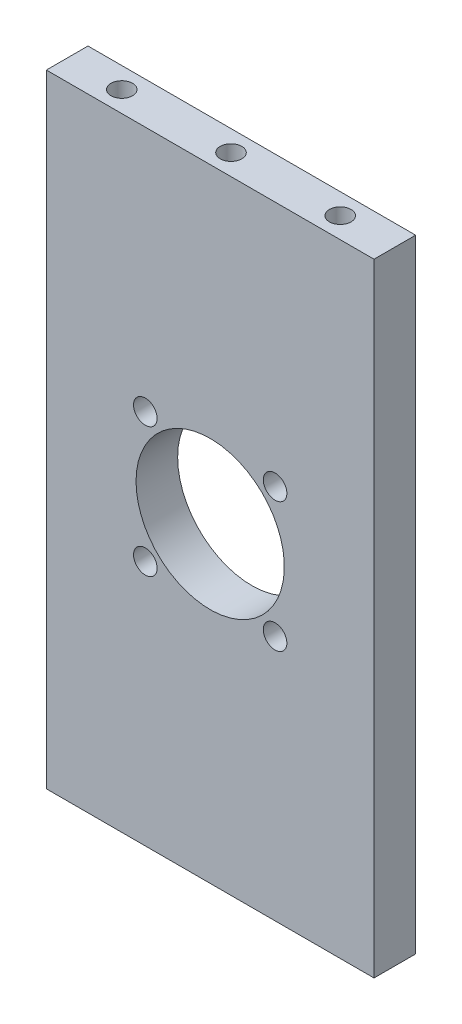
ISO-10303-21;
HEADER;
FILE_DESCRIPTION(('STEP AP214'),'2;1');
FILE_NAME('part.step','',(''),(''),'','','');
FILE_SCHEMA(('AUTOMOTIVE_DESIGN { 1 0 10303 214 1 1 1 1 }'));
ENDSEC;
DATA;
#1=APPLICATION_CONTEXT('core data for automotive mechanical design processes');
#2=APPLICATION_PROTOCOL_DEFINITION('international standard','automotive_design',2000,#1);
#3=PRODUCT_CONTEXT('',#1,'mechanical');
#4=PRODUCT('Part','Part','',(#3));
#5=PRODUCT_RELATED_PRODUCT_CATEGORY('part','',(#4));
#6=PRODUCT_DEFINITION_FORMATION('','',#4);
#7=PRODUCT_DEFINITION_CONTEXT('part definition',#1,'design');
#8=PRODUCT_DEFINITION('design','',#6,#7);
#9=PRODUCT_DEFINITION_SHAPE('','',#8);
#10=(LENGTH_UNIT() NAMED_UNIT(*) SI_UNIT(.MILLI.,.METRE.));
#11=(NAMED_UNIT(*) PLANE_ANGLE_UNIT() SI_UNIT($,.RADIAN.));
#12=(NAMED_UNIT(*) SI_UNIT($,.STERADIAN.) SOLID_ANGLE_UNIT());
#13=UNCERTAINTY_MEASURE_WITH_UNIT(LENGTH_MEASURE(1.E-05),#10,'distance_accuracy_value','');
#14=(GEOMETRIC_REPRESENTATION_CONTEXT(3) GLOBAL_UNCERTAINTY_ASSIGNED_CONTEXT((#13)) GLOBAL_UNIT_ASSIGNED_CONTEXT((#10,
#11,#12)) REPRESENTATION_CONTEXT('',''));
#15=CARTESIAN_POINT('',(0.,0.,0.));
#16=DIRECTION('',(0.,0.,1.));
#17=DIRECTION('',(1.,0.,0.));
#18=AXIS2_PLACEMENT_3D('',#15,#16,#17);
#19=CARTESIAN_POINT('',(25.,-47.5,-6.35));
#20=DIRECTION('',(1.,0.,0.));
#21=DIRECTION('',(0.,0.,-1.));
#22=AXIS2_PLACEMENT_3D('',#19,#20,#21);
#23=PLANE('',#22);
#24=DIRECTION('',(0.,1.,0.));
#25=VECTOR('',#24,1.);
#26=CARTESIAN_POINT('',(25.,-47.5,0.));
#27=LINE('',#26,#25);
#28=CARTESIAN_POINT('',(25.,-47.5,0.));
#29=VERTEX_POINT('',#28);
#30=CARTESIAN_POINT('',(25.,47.5,0.));
#31=VERTEX_POINT('',#30);
#32=EDGE_CURVE('E173',#29,#31,#27,.T.);
#33=ORIENTED_EDGE('',*,*,#32,.F.);
#34=DIRECTION('',(0.,0.,1.));
#35=VECTOR('',#34,1.);
#36=CARTESIAN_POINT('',(25.,-47.5,-6.35));
#37=LINE('',#36,#35);
#38=CARTESIAN_POINT('',(25.,-47.5,-6.35));
#39=VERTEX_POINT('',#38);
#40=EDGE_CURVE('E11',#39,#29,#37,.T.);
#41=ORIENTED_EDGE('',*,*,#40,.F.);
#42=DIRECTION('',(0.,1.,0.));
#43=VECTOR('',#42,1.);
#44=CARTESIAN_POINT('',(25.,-47.5,-6.35));
#45=LINE('',#44,#43);
#46=CARTESIAN_POINT('',(25.,47.5,-6.35));
#47=VERTEX_POINT('',#46);
#48=EDGE_CURVE('E174',#39,#47,#45,.T.);
#49=ORIENTED_EDGE('',*,*,#48,.T.);
#50=DIRECTION('',(0.,0.,1.));
#51=VECTOR('',#50,1.);
#52=CARTESIAN_POINT('',(25.,47.5,-6.35));
#53=LINE('',#52,#51);
#54=EDGE_CURVE('E50',#47,#31,#53,.T.);
#55=ORIENTED_EDGE('',*,*,#54,.T.);
#56=EDGE_LOOP('',(#33,#41,#49,#55));
#57=FACE_BOUND('',#56,.T.);
#58=ADVANCED_FACE('F47',(#57),#23,.T.);
#59=CARTESIAN_POINT('',(-25.,-47.5,-6.35));
#60=DIRECTION('',(0.,-1.,0.));
#61=DIRECTION('',(0.,0.,-1.));
#62=AXIS2_PLACEMENT_3D('',#59,#60,#61);
#63=PLANE('',#62);
#64=CARTESIAN_POINT('',(16.67,-47.5,-3.175));
#65=DIRECTION('',(0.,-1.,0.));
#66=DIRECTION('',(0.,0.,-1.));
#67=AXIS2_PLACEMENT_3D('',#64,#65,#66);
#68=CIRCLE('',#67,1.65);
#69=CARTESIAN_POINT('',(16.67,-47.5,-4.825));
#70=VERTEX_POINT('',#69);
#71=EDGE_CURVE('E149',#70,#70,#68,.T.);
#72=ORIENTED_EDGE('',*,*,#71,.F.);
#73=EDGE_LOOP('',(#72));
#74=FACE_BOUND('',#73,.T.);
#75=CARTESIAN_POINT('',(0.,-47.5,-3.175));
#76=DIRECTION('',(0.,-1.,0.));
#77=DIRECTION('',(0.,0.,-1.));
#78=AXIS2_PLACEMENT_3D('',#75,#76,#77);
#79=CIRCLE('',#78,1.65);
#80=CARTESIAN_POINT('',(0.,-47.5,-4.825));
#81=VERTEX_POINT('',#80);
#82=EDGE_CURVE('E157',#81,#81,#79,.T.);
#83=ORIENTED_EDGE('',*,*,#82,.F.);
#84=EDGE_LOOP('',(#83));
#85=FACE_BOUND('',#84,.T.);
#86=CARTESIAN_POINT('',(-16.67,-47.5,-3.175));
#87=DIRECTION('',(0.,-1.,0.));
#88=DIRECTION('',(0.,0.,-1.));
#89=AXIS2_PLACEMENT_3D('',#86,#87,#88);
#90=CIRCLE('',#89,1.65);
#91=CARTESIAN_POINT('',(-16.67,-47.5,-4.825));
#92=VERTEX_POINT('',#91);
#93=EDGE_CURVE('E165',#92,#92,#90,.T.);
#94=ORIENTED_EDGE('',*,*,#93,.F.);
#95=EDGE_LOOP('',(#94));
#96=FACE_BOUND('',#95,.T.);
#97=DIRECTION('',(1.,0.,0.));
#98=VECTOR('',#97,1.);
#99=CARTESIAN_POINT('',(-25.,-47.5,0.));
#100=LINE('',#99,#98);
#101=CARTESIAN_POINT('',(-25.,-47.5,0.));
#102=VERTEX_POINT('',#101);
#103=EDGE_CURVE('E178',#102,#29,#100,.T.);
#104=ORIENTED_EDGE('',*,*,#103,.F.);
#105=DIRECTION('',(0.,0.,1.));
#106=VECTOR('',#105,1.);
#107=CARTESIAN_POINT('',(-25.,-47.5,-6.35));
#108=LINE('',#107,#106);
#109=CARTESIAN_POINT('',(-25.,-47.5,-6.35));
#110=VERTEX_POINT('',#109);
#111=EDGE_CURVE('E57',#110,#102,#108,.T.);
#112=ORIENTED_EDGE('',*,*,#111,.F.);
#113=DIRECTION('',(1.,0.,0.));
#114=VECTOR('',#113,1.);
#115=CARTESIAN_POINT('',(-25.,-47.5,-6.35));
#116=LINE('',#115,#114);
#117=EDGE_CURVE('E184',#110,#39,#116,.T.);
#118=ORIENTED_EDGE('',*,*,#117,.T.);
#119=ORIENTED_EDGE('',*,*,#40,.T.);
#120=EDGE_LOOP('',(#104,#112,#118,#119));
#121=FACE_BOUND('',#120,.T.);
#122=ADVANCED_FACE('F211',(#74,#85,#96,#121),#63,.T.);
#123=CARTESIAN_POINT('',(-25.,-47.5,-6.35));
#124=DIRECTION('',(-1.,0.,0.));
#125=DIRECTION('',(0.,0.,1.));
#126=AXIS2_PLACEMENT_3D('',#123,#124,#125);
#127=PLANE('',#126);
#128=DIRECTION('',(0.,-1.,0.));
#129=VECTOR('',#128,1.);
#130=CARTESIAN_POINT('',(-25.,-47.5,0.));
#131=LINE('',#130,#129);
#132=CARTESIAN_POINT('',(-25.,47.5,0.));
#133=VERTEX_POINT('',#132);
#134=EDGE_CURVE('E194',#133,#102,#131,.T.);
#135=ORIENTED_EDGE('',*,*,#134,.F.);
#136=DIRECTION('',(0.,0.,1.));
#137=VECTOR('',#136,1.);
#138=CARTESIAN_POINT('',(-25.,47.5,-6.35));
#139=LINE('',#138,#137);
#140=CARTESIAN_POINT('',(-25.,47.5,-6.35));
#141=VERTEX_POINT('',#140);
#142=EDGE_CURVE('E201',#141,#133,#139,.T.);
#143=ORIENTED_EDGE('',*,*,#142,.F.);
#144=DIRECTION('',(0.,-1.,0.));
#145=VECTOR('',#144,1.);
#146=CARTESIAN_POINT('',(-25.,-47.5,-6.35));
#147=LINE('',#146,#145);
#148=EDGE_CURVE('E181',#141,#110,#147,.T.);
#149=ORIENTED_EDGE('',*,*,#148,.T.);
#150=ORIENTED_EDGE('',*,*,#111,.T.);
#151=EDGE_LOOP('',(#135,#143,#149,#150));
#152=FACE_BOUND('',#151,.T.);
#153=ADVANCED_FACE('F214',(#152),#127,.T.);
#154=CARTESIAN_POINT('',(-25.,47.5,-6.35));
#155=DIRECTION('',(0.,1.,0.));
#156=DIRECTION('',(0.,0.,1.));
#157=AXIS2_PLACEMENT_3D('',#154,#155,#156);
#158=PLANE('',#157);
#159=CARTESIAN_POINT('',(-16.67,47.5,-3.175));
#160=DIRECTION('',(0.,1.,0.));
#161=DIRECTION('',(0.,0.,1.));
#162=AXIS2_PLACEMENT_3D('',#159,#160,#161);
#163=CIRCLE('',#162,1.65);
#164=CARTESIAN_POINT('',(-16.67,47.5,-1.525));
#165=VERTEX_POINT('',#164);
#166=EDGE_CURVE('E124',#165,#165,#163,.T.);
#167=ORIENTED_EDGE('',*,*,#166,.F.);
#168=EDGE_LOOP('',(#167));
#169=FACE_BOUND('',#168,.T.);
#170=CARTESIAN_POINT('',(0.,47.5,-3.175));
#171=DIRECTION('',(0.,1.,0.));
#172=DIRECTION('',(0.,0.,1.));
#173=AXIS2_PLACEMENT_3D('',#170,#171,#172);
#174=CIRCLE('',#173,1.65);
#175=CARTESIAN_POINT('',(0.,47.5,-1.525));
#176=VERTEX_POINT('',#175);
#177=EDGE_CURVE('E123',#176,#176,#174,.T.);
#178=ORIENTED_EDGE('',*,*,#177,.F.);
#179=EDGE_LOOP('',(#178));
#180=FACE_BOUND('',#179,.T.);
#181=CARTESIAN_POINT('',(16.67,47.5,-3.175));
#182=DIRECTION('',(0.,1.,0.));
#183=DIRECTION('',(0.,0.,1.));
#184=AXIS2_PLACEMENT_3D('',#181,#182,#183);
#185=CIRCLE('',#184,1.65);
#186=CARTESIAN_POINT('',(16.67,47.5,-1.525));
#187=VERTEX_POINT('',#186);
#188=EDGE_CURVE('E141',#187,#187,#185,.T.);
#189=ORIENTED_EDGE('',*,*,#188,.F.);
#190=EDGE_LOOP('',(#189));
#191=FACE_BOUND('',#190,.T.);
#192=DIRECTION('',(-1.,0.,0.));
#193=VECTOR('',#192,1.);
#194=CARTESIAN_POINT('',(-25.,47.5,0.));
#195=LINE('',#194,#193);
#196=EDGE_CURVE('E190',#31,#133,#195,.T.);
#197=ORIENTED_EDGE('',*,*,#196,.F.);
#198=ORIENTED_EDGE('',*,*,#54,.F.);
#199=DIRECTION('',(-1.,0.,0.));
#200=VECTOR('',#199,1.);
#201=CARTESIAN_POINT('',(-25.,47.5,-6.35));
#202=LINE('',#201,#200);
#203=EDGE_CURVE('E177',#47,#141,#202,.T.);
#204=ORIENTED_EDGE('',*,*,#203,.T.);
#205=ORIENTED_EDGE('',*,*,#142,.T.);
#206=EDGE_LOOP('',(#197,#198,#204,#205));
#207=FACE_BOUND('',#206,.T.);
#208=ADVANCED_FACE('F208',(#169,#180,#191,#207),#158,.T.);
#209=CARTESIAN_POINT('',(0.,0.,-6.35));
#210=DIRECTION('',(0.,0.,-1.));
#211=DIRECTION('',(-1.,0.,0.));
#212=AXIS2_PLACEMENT_3D('',#209,#210,#211);
#213=PLANE('',#212);
#214=CARTESIAN_POINT('',(-9.89949493661168,9.89949493661165,-6.35));
#215=DIRECTION('',(0.,0.,-1.));
#216=DIRECTION('',(-1.,0.,0.));
#217=AXIS2_PLACEMENT_3D('',#214,#215,#216);
#218=CIRCLE('',#217,1.79999999999999);
#219=CARTESIAN_POINT('',(-11.6994949366117,9.89949493661165,-6.35));
#220=VERTEX_POINT('',#219);
#221=EDGE_CURVE('E316',#220,#220,#218,.T.);
#222=ORIENTED_EDGE('',*,*,#221,.F.);
#223=EDGE_LOOP('',(#222));
#224=FACE_BOUND('',#223,.T.);
#225=CARTESIAN_POINT('',(-9.89949493661219,-9.89949493661169,-6.35));
#226=DIRECTION('',(0.,0.,-1.));
#227=DIRECTION('',(-1.,0.,0.));
#228=AXIS2_PLACEMENT_3D('',#225,#226,#227);
#229=CIRCLE('',#228,1.79999999999999);
#230=CARTESIAN_POINT('',(-11.6994949366122,-9.89949493661169,-6.35));
#231=VERTEX_POINT('',#230);
#232=EDGE_CURVE('E322',#231,#231,#229,.T.);
#233=ORIENTED_EDGE('',*,*,#232,.F.);
#234=EDGE_LOOP('',(#233));
#235=FACE_BOUND('',#234,.T.);
#236=CARTESIAN_POINT('',(9.89949493661114,-9.8994949366122,-6.35));
#237=DIRECTION('',(0.,0.,-1.));
#238=DIRECTION('',(-1.,0.,0.));
#239=AXIS2_PLACEMENT_3D('',#236,#237,#238);
#240=CIRCLE('',#239,1.79999999999999);
#241=CARTESIAN_POINT('',(8.09949493661115,-9.8994949366122,-6.35));
#242=VERTEX_POINT('',#241);
#243=EDGE_CURVE('E332',#242,#242,#240,.T.);
#244=ORIENTED_EDGE('',*,*,#243,.F.);
#245=EDGE_LOOP('',(#244));
#246=FACE_BOUND('',#245,.T.);
#247=CARTESIAN_POINT('',(9.89949493661165,9.89949493661114,-6.35));
#248=DIRECTION('',(0.,0.,-1.));
#249=DIRECTION('',(-1.,0.,0.));
#250=AXIS2_PLACEMENT_3D('',#247,#248,#249);
#251=CIRCLE('',#250,1.79999999999999);
#252=CARTESIAN_POINT('',(8.09949493661166,9.89949493661114,-6.35));
#253=VERTEX_POINT('',#252);
#254=EDGE_CURVE('E340',#253,#253,#251,.T.);
#255=ORIENTED_EDGE('',*,*,#254,.F.);
#256=EDGE_LOOP('',(#255));
#257=FACE_BOUND('',#256,.T.);
#258=CARTESIAN_POINT('',(0.,0.,-6.35));
#259=DIRECTION('',(0.,0.,-1.));
#260=DIRECTION('',(-1.,0.,0.));
#261=AXIS2_PLACEMENT_3D('',#258,#259,#260);
#262=CIRCLE('',#261,11.3175);
#263=CARTESIAN_POINT('',(-11.3175,0.,-6.35));
#264=VERTEX_POINT('',#263);
#265=EDGE_CURVE('E348',#264,#264,#262,.T.);
#266=ORIENTED_EDGE('',*,*,#265,.F.);
#267=EDGE_LOOP('',(#266));
#268=FACE_BOUND('',#267,.T.);
#269=ORIENTED_EDGE('',*,*,#48,.F.);
#270=ORIENTED_EDGE('',*,*,#117,.F.);
#271=ORIENTED_EDGE('',*,*,#148,.F.);
#272=ORIENTED_EDGE('',*,*,#203,.F.);
#273=EDGE_LOOP('',(#269,#270,#271,#272));
#274=FACE_BOUND('',#273,.T.);
#275=ADVANCED_FACE('F216',(#224,#235,#246,#257,#268,#274),#213,.T.);
#276=CARTESIAN_POINT('',(0.,0.,0.));
#277=DIRECTION('',(0.,0.,-1.));
#278=DIRECTION('',(-1.,0.,0.));
#279=AXIS2_PLACEMENT_3D('',#276,#277,#278);
#280=PLANE('',#279);
#281=CARTESIAN_POINT('',(-9.89949493661168,9.89949493661165,0.));
#282=DIRECTION('',(0.,0.,-1.));
#283=DIRECTION('',(-1.,0.,0.));
#284=AXIS2_PLACEMENT_3D('',#281,#282,#283);
#285=CIRCLE('',#284,1.8);
#286=CARTESIAN_POINT('',(-11.6994949366117,9.89949493661165,0.));
#287=VERTEX_POINT('',#286);
#288=EDGE_CURVE('E314',#287,#287,#285,.T.);
#289=ORIENTED_EDGE('',*,*,#288,.T.);
#290=EDGE_LOOP('',(#289));
#291=FACE_BOUND('',#290,.T.);
#292=CARTESIAN_POINT('',(-9.89949493661219,-9.89949493661169,0.));
#293=DIRECTION('',(0.,0.,-1.));
#294=DIRECTION('',(-1.,0.,0.));
#295=AXIS2_PLACEMENT_3D('',#292,#293,#294);
#296=CIRCLE('',#295,1.8);
#297=CARTESIAN_POINT('',(-11.6994949366122,-9.89949493661169,0.));
#298=VERTEX_POINT('',#297);
#299=EDGE_CURVE('E328',#298,#298,#296,.T.);
#300=ORIENTED_EDGE('',*,*,#299,.T.);
#301=EDGE_LOOP('',(#300));
#302=FACE_BOUND('',#301,.T.);
#303=CARTESIAN_POINT('',(9.89949493661114,-9.8994949366122,0.));
#304=DIRECTION('',(0.,0.,-1.));
#305=DIRECTION('',(-1.,0.,0.));
#306=AXIS2_PLACEMENT_3D('',#303,#304,#305);
#307=CIRCLE('',#306,1.8);
#308=CARTESIAN_POINT('',(8.09949493661114,-9.8994949366122,0.));
#309=VERTEX_POINT('',#308);
#310=EDGE_CURVE('E336',#309,#309,#307,.T.);
#311=ORIENTED_EDGE('',*,*,#310,.T.);
#312=EDGE_LOOP('',(#311));
#313=FACE_BOUND('',#312,.T.);
#314=CARTESIAN_POINT('',(9.89949493661165,9.89949493661114,0.));
#315=DIRECTION('',(0.,0.,-1.));
#316=DIRECTION('',(-1.,0.,0.));
#317=AXIS2_PLACEMENT_3D('',#314,#315,#316);
#318=CIRCLE('',#317,1.8);
#319=CARTESIAN_POINT('',(8.09949493661165,9.89949493661114,0.));
#320=VERTEX_POINT('',#319);
#321=EDGE_CURVE('E344',#320,#320,#318,.T.);
#322=ORIENTED_EDGE('',*,*,#321,.T.);
#323=EDGE_LOOP('',(#322));
#324=FACE_BOUND('',#323,.T.);
#325=CARTESIAN_POINT('',(0.,0.,0.));
#326=DIRECTION('',(0.,0.,-1.));
#327=DIRECTION('',(-1.,0.,0.));
#328=AXIS2_PLACEMENT_3D('',#325,#326,#327);
#329=CIRCLE('',#328,11.3175);
#330=CARTESIAN_POINT('',(-11.3175,0.,0.));
#331=VERTEX_POINT('',#330);
#332=EDGE_CURVE('E134',#331,#331,#329,.T.);
#333=ORIENTED_EDGE('',*,*,#332,.T.);
#334=EDGE_LOOP('',(#333));
#335=FACE_BOUND('',#334,.T.);
#336=ORIENTED_EDGE('',*,*,#32,.T.);
#337=ORIENTED_EDGE('',*,*,#196,.T.);
#338=ORIENTED_EDGE('',*,*,#134,.T.);
#339=ORIENTED_EDGE('',*,*,#103,.T.);
#340=EDGE_LOOP('',(#336,#337,#338,#339));
#341=FACE_BOUND('',#340,.T.);
#342=ADVANCED_FACE('F210',(#291,#302,#313,#324,#335,#341),#280,.F.);
#343=CARTESIAN_POINT('',(-16.67,-37.5,-3.175));
#344=DIRECTION('',(0.,-1.,0.));
#345=DIRECTION('',(0.,0.,-1.));
#346=AXIS2_PLACEMENT_3D('',#343,#344,#345);
#347=CONICAL_SURFACE('',#346,1.65,1.02974425867665);
#348=CARTESIAN_POINT('',(-16.67,-36.5085799786045,-3.175));
#349=VERTEX_POINT('',#348);
#350=VERTEX_LOOP('',#349);
#351=FACE_BOUND('',#350,.T.);
#352=CARTESIAN_POINT('',(-16.67,-37.5,-3.175));
#353=DIRECTION('',(0.,-1.,0.));
#354=DIRECTION('',(0.,0.,-1.));
#355=AXIS2_PLACEMENT_3D('',#352,#353,#354);
#356=CIRCLE('',#355,1.65);
#357=CARTESIAN_POINT('',(-16.67,-37.5,-4.825));
#358=VERTEX_POINT('',#357);
#359=EDGE_CURVE('E169',#358,#358,#356,.T.);
#360=ORIENTED_EDGE('',*,*,#359,.T.);
#361=EDGE_LOOP('',(#360));
#362=FACE_BOUND('',#361,.T.);
#363=ADVANCED_FACE('F224',(#351,#362),#347,.F.);
#364=CARTESIAN_POINT('',(-16.67,-47.5,-3.175));
#365=DIRECTION('',(0.,-1.,0.));
#366=DIRECTION('',(0.,0.,-1.));
#367=AXIS2_PLACEMENT_3D('',#364,#365,#366);
#368=CYLINDRICAL_SURFACE('',#367,1.65);
#369=ORIENTED_EDGE('',*,*,#359,.F.);
#370=EDGE_LOOP('',(#369));
#371=FACE_BOUND('',#370,.T.);
#372=ORIENTED_EDGE('',*,*,#93,.T.);
#373=EDGE_LOOP('',(#372));
#374=FACE_BOUND('',#373,.T.);
#375=ADVANCED_FACE('F249',(#371,#374),#368,.F.);
#376=CARTESIAN_POINT('',(0.,-37.5,-3.175));
#377=DIRECTION('',(0.,-1.,0.));
#378=DIRECTION('',(0.,0.,-1.));
#379=AXIS2_PLACEMENT_3D('',#376,#377,#378);
#380=CONICAL_SURFACE('',#379,1.65,1.02974425867665);
#381=CARTESIAN_POINT('',(0.,-36.5085799786045,-3.175));
#382=VERTEX_POINT('',#381);
#383=VERTEX_LOOP('',#382);
#384=FACE_BOUND('',#383,.T.);
#385=CARTESIAN_POINT('',(0.,-37.5,-3.175));
#386=DIRECTION('',(0.,-1.,0.));
#387=DIRECTION('',(0.,0.,-1.));
#388=AXIS2_PLACEMENT_3D('',#385,#386,#387);
#389=CIRCLE('',#388,1.65);
#390=CARTESIAN_POINT('',(0.,-37.5,-4.825));
#391=VERTEX_POINT('',#390);
#392=EDGE_CURVE('E161',#391,#391,#389,.T.);
#393=ORIENTED_EDGE('',*,*,#392,.T.);
#394=EDGE_LOOP('',(#393));
#395=FACE_BOUND('',#394,.T.);
#396=ADVANCED_FACE('F251',(#384,#395),#380,.F.);
#397=CARTESIAN_POINT('',(0.,-47.5,-3.175));
#398=DIRECTION('',(0.,-1.,0.));
#399=DIRECTION('',(0.,0.,-1.));
#400=AXIS2_PLACEMENT_3D('',#397,#398,#399);
#401=CYLINDRICAL_SURFACE('',#400,1.65);
#402=ORIENTED_EDGE('',*,*,#392,.F.);
#403=EDGE_LOOP('',(#402));
#404=FACE_BOUND('',#403,.T.);
#405=ORIENTED_EDGE('',*,*,#82,.T.);
#406=EDGE_LOOP('',(#405));
#407=FACE_BOUND('',#406,.T.);
#408=ADVANCED_FACE('F257',(#404,#407),#401,.F.);
#409=CARTESIAN_POINT('',(16.67,-37.5,-3.175));
#410=DIRECTION('',(0.,-1.,0.));
#411=DIRECTION('',(0.,0.,-1.));
#412=AXIS2_PLACEMENT_3D('',#409,#410,#411);
#413=CONICAL_SURFACE('',#412,1.65,1.02974425867665);
#414=CARTESIAN_POINT('',(16.67,-36.5085799786045,-3.175));
#415=VERTEX_POINT('',#414);
#416=VERTEX_LOOP('',#415);
#417=FACE_BOUND('',#416,.T.);
#418=CARTESIAN_POINT('',(16.67,-37.5,-3.175));
#419=DIRECTION('',(0.,-1.,0.));
#420=DIRECTION('',(0.,0.,-1.));
#421=AXIS2_PLACEMENT_3D('',#418,#419,#420);
#422=CIRCLE('',#421,1.65);
#423=CARTESIAN_POINT('',(16.67,-37.5,-4.825));
#424=VERTEX_POINT('',#423);
#425=EDGE_CURVE('E153',#424,#424,#422,.T.);
#426=ORIENTED_EDGE('',*,*,#425,.T.);
#427=EDGE_LOOP('',(#426));
#428=FACE_BOUND('',#427,.T.);
#429=ADVANCED_FACE('F265',(#417,#428),#413,.F.);
#430=CARTESIAN_POINT('',(16.67,-47.5,-3.175));
#431=DIRECTION('',(0.,-1.,0.));
#432=DIRECTION('',(0.,0.,-1.));
#433=AXIS2_PLACEMENT_3D('',#430,#431,#432);
#434=CYLINDRICAL_SURFACE('',#433,1.65);
#435=ORIENTED_EDGE('',*,*,#425,.F.);
#436=EDGE_LOOP('',(#435));
#437=FACE_BOUND('',#436,.T.);
#438=ORIENTED_EDGE('',*,*,#71,.T.);
#439=EDGE_LOOP('',(#438));
#440=FACE_BOUND('',#439,.T.);
#441=ADVANCED_FACE('F269',(#437,#440),#434,.F.);
#442=CARTESIAN_POINT('',(16.67,37.5,-3.175));
#443=DIRECTION('',(0.,1.,0.));
#444=DIRECTION('',(0.,0.,1.));
#445=AXIS2_PLACEMENT_3D('',#442,#443,#444);
#446=CONICAL_SURFACE('',#445,1.65,1.02974425867665);
#447=CARTESIAN_POINT('',(16.67,36.5085799786045,-3.175));
#448=VERTEX_POINT('',#447);
#449=VERTEX_LOOP('',#448);
#450=FACE_BOUND('',#449,.T.);
#451=CARTESIAN_POINT('',(16.67,37.5,-3.175));
#452=DIRECTION('',(0.,1.,0.));
#453=DIRECTION('',(0.,0.,1.));
#454=AXIS2_PLACEMENT_3D('',#451,#452,#453);
#455=CIRCLE('',#454,1.65);
#456=CARTESIAN_POINT('',(16.67,37.5,-1.525));
#457=VERTEX_POINT('',#456);
#458=EDGE_CURVE('E145',#457,#457,#455,.T.);
#459=ORIENTED_EDGE('',*,*,#458,.T.);
#460=EDGE_LOOP('',(#459));
#461=FACE_BOUND('',#460,.T.);
#462=ADVANCED_FACE('F273',(#450,#461),#446,.F.);
#463=CARTESIAN_POINT('',(16.67,47.5,-3.175));
#464=DIRECTION('',(0.,1.,0.));
#465=DIRECTION('',(0.,0.,1.));
#466=AXIS2_PLACEMENT_3D('',#463,#464,#465);
#467=CYLINDRICAL_SURFACE('',#466,1.65);
#468=ORIENTED_EDGE('',*,*,#458,.F.);
#469=EDGE_LOOP('',(#468));
#470=FACE_BOUND('',#469,.T.);
#471=ORIENTED_EDGE('',*,*,#188,.T.);
#472=EDGE_LOOP('',(#471));
#473=FACE_BOUND('',#472,.T.);
#474=ADVANCED_FACE('F277',(#470,#473),#467,.F.);
#475=CARTESIAN_POINT('',(0.,37.5,-3.175));
#476=DIRECTION('',(0.,1.,0.));
#477=DIRECTION('',(0.,0.,1.));
#478=AXIS2_PLACEMENT_3D('',#475,#476,#477);
#479=CONICAL_SURFACE('',#478,1.65,1.02974425867665);
#480=CARTESIAN_POINT('',(0.,36.5085799786045,-3.175));
#481=VERTEX_POINT('',#480);
#482=VERTEX_LOOP('',#481);
#483=FACE_BOUND('',#482,.T.);
#484=CARTESIAN_POINT('',(0.,37.5,-3.175));
#485=DIRECTION('',(0.,1.,0.));
#486=DIRECTION('',(0.,0.,1.));
#487=AXIS2_PLACEMENT_3D('',#484,#485,#486);
#488=CIRCLE('',#487,1.65);
#489=CARTESIAN_POINT('',(0.,37.5,-1.525));
#490=VERTEX_POINT('',#489);
#491=EDGE_CURVE('E131',#490,#490,#488,.T.);
#492=ORIENTED_EDGE('',*,*,#491,.T.);
#493=EDGE_LOOP('',(#492));
#494=FACE_BOUND('',#493,.T.);
#495=ADVANCED_FACE('F281',(#483,#494),#479,.F.);
#496=CARTESIAN_POINT('',(0.,47.5,-3.175));
#497=DIRECTION('',(0.,1.,0.));
#498=DIRECTION('',(0.,0.,1.));
#499=AXIS2_PLACEMENT_3D('',#496,#497,#498);
#500=CYLINDRICAL_SURFACE('',#499,1.65);
#501=ORIENTED_EDGE('',*,*,#491,.F.);
#502=EDGE_LOOP('',(#501));
#503=FACE_BOUND('',#502,.T.);
#504=ORIENTED_EDGE('',*,*,#177,.T.);
#505=EDGE_LOOP('',(#504));
#506=FACE_BOUND('',#505,.T.);
#507=ADVANCED_FACE('F116',(#503,#506),#500,.F.);
#508=CARTESIAN_POINT('',(-16.67,37.5,-3.175));
#509=DIRECTION('',(0.,1.,0.));
#510=DIRECTION('',(0.,0.,1.));
#511=AXIS2_PLACEMENT_3D('',#508,#509,#510);
#512=CONICAL_SURFACE('',#511,1.65,1.02974425867665);
#513=CARTESIAN_POINT('',(-16.67,36.5085799786045,-3.175));
#514=VERTEX_POINT('',#513);
#515=VERTEX_LOOP('',#514);
#516=FACE_BOUND('',#515,.T.);
#517=CARTESIAN_POINT('',(-16.67,37.5,-3.175));
#518=DIRECTION('',(0.,1.,0.));
#519=DIRECTION('',(0.,0.,1.));
#520=AXIS2_PLACEMENT_3D('',#517,#518,#519);
#521=CIRCLE('',#520,1.65);
#522=CARTESIAN_POINT('',(-16.67,37.5,-1.525));
#523=VERTEX_POINT('',#522);
#524=EDGE_CURVE('E120',#523,#523,#521,.T.);
#525=ORIENTED_EDGE('',*,*,#524,.T.);
#526=EDGE_LOOP('',(#525));
#527=FACE_BOUND('',#526,.T.);
#528=ADVANCED_FACE('F112',(#516,#527),#512,.F.);
#529=CARTESIAN_POINT('',(-16.67,47.5,-3.175));
#530=DIRECTION('',(0.,1.,0.));
#531=DIRECTION('',(0.,0.,1.));
#532=AXIS2_PLACEMENT_3D('',#529,#530,#531);
#533=CYLINDRICAL_SURFACE('',#532,1.65);
#534=ORIENTED_EDGE('',*,*,#524,.F.);
#535=EDGE_LOOP('',(#534));
#536=FACE_BOUND('',#535,.T.);
#537=ORIENTED_EDGE('',*,*,#166,.T.);
#538=EDGE_LOOP('',(#537));
#539=FACE_BOUND('',#538,.T.);
#540=ADVANCED_FACE('F115',(#536,#539),#533,.F.);
#541=CARTESIAN_POINT('',(0.,0.,0.));
#542=DIRECTION('',(0.,0.,-1.));
#543=DIRECTION('',(-1.,0.,0.));
#544=AXIS2_PLACEMENT_3D('',#541,#542,#543);
#545=CYLINDRICAL_SURFACE('',#544,11.3175);
#546=ORIENTED_EDGE('',*,*,#332,.F.);
#547=EDGE_LOOP('',(#546));
#548=FACE_BOUND('',#547,.T.);
#549=ORIENTED_EDGE('',*,*,#265,.T.);
#550=EDGE_LOOP('',(#549));
#551=FACE_BOUND('',#550,.T.);
#552=ADVANCED_FACE('F291',(#548,#551),#545,.F.);
#553=CARTESIAN_POINT('',(9.89949493661165,9.89949493661114,-6.35));
#554=DIRECTION('',(0.,0.,-1.));
#555=DIRECTION('',(-1.,0.,0.));
#556=AXIS2_PLACEMENT_3D('',#553,#554,#555);
#557=CYLINDRICAL_SURFACE('',#556,1.79999999999999);
#558=ORIENTED_EDGE('',*,*,#321,.F.);
#559=EDGE_LOOP('',(#558));
#560=FACE_BOUND('',#559,.T.);
#561=ORIENTED_EDGE('',*,*,#254,.T.);
#562=EDGE_LOOP('',(#561));
#563=FACE_BOUND('',#562,.T.);
#564=ADVANCED_FACE('F293',(#560,#563),#557,.F.);
#565=CARTESIAN_POINT('',(9.89949493661114,-9.8994949366122,-6.35));
#566=DIRECTION('',(0.,0.,-1.));
#567=DIRECTION('',(-1.,0.,0.));
#568=AXIS2_PLACEMENT_3D('',#565,#566,#567);
#569=CYLINDRICAL_SURFACE('',#568,1.79999999999999);
#570=ORIENTED_EDGE('',*,*,#310,.F.);
#571=EDGE_LOOP('',(#570));
#572=FACE_BOUND('',#571,.T.);
#573=ORIENTED_EDGE('',*,*,#243,.T.);
#574=EDGE_LOOP('',(#573));
#575=FACE_BOUND('',#574,.T.);
#576=ADVANCED_FACE('F297',(#572,#575),#569,.F.);
#577=CARTESIAN_POINT('',(-9.89949493661219,-9.89949493661169,-6.35));
#578=DIRECTION('',(0.,0.,-1.));
#579=DIRECTION('',(-1.,0.,0.));
#580=AXIS2_PLACEMENT_3D('',#577,#578,#579);
#581=CYLINDRICAL_SURFACE('',#580,1.79999999999999);
#582=ORIENTED_EDGE('',*,*,#299,.F.);
#583=EDGE_LOOP('',(#582));
#584=FACE_BOUND('',#583,.T.);
#585=ORIENTED_EDGE('',*,*,#232,.T.);
#586=EDGE_LOOP('',(#585));
#587=FACE_BOUND('',#586,.T.);
#588=ADVANCED_FACE('F301',(#584,#587),#581,.F.);
#589=CARTESIAN_POINT('',(-9.89949493661168,9.89949493661165,-6.35));
#590=DIRECTION('',(0.,0.,-1.));
#591=DIRECTION('',(-1.,0.,0.));
#592=AXIS2_PLACEMENT_3D('',#589,#590,#591);
#593=CYLINDRICAL_SURFACE('',#592,1.79999999999999);
#594=ORIENTED_EDGE('',*,*,#288,.F.);
#595=EDGE_LOOP('',(#594));
#596=FACE_BOUND('',#595,.T.);
#597=ORIENTED_EDGE('',*,*,#221,.T.);
#598=EDGE_LOOP('',(#597));
#599=FACE_BOUND('',#598,.T.);
#600=ADVANCED_FACE('F305',(#596,#599),#593,.F.);
#601=CLOSED_SHELL('',(#58,#122,#153,#208,#275,#342,#363,#375,#396,#408,#429,#441,#462,#474,#495,
#507,#528,#540,#552,#564,#576,#588,#600));
#602=MANIFOLD_SOLID_BREP('B2',#601);
#603=ADVANCED_BREP_SHAPE_REPRESENTATION('',(#18,#602),#14);
#604=SHAPE_DEFINITION_REPRESENTATION(#9,#603);
ENDSEC;
END-ISO-10303-21;
